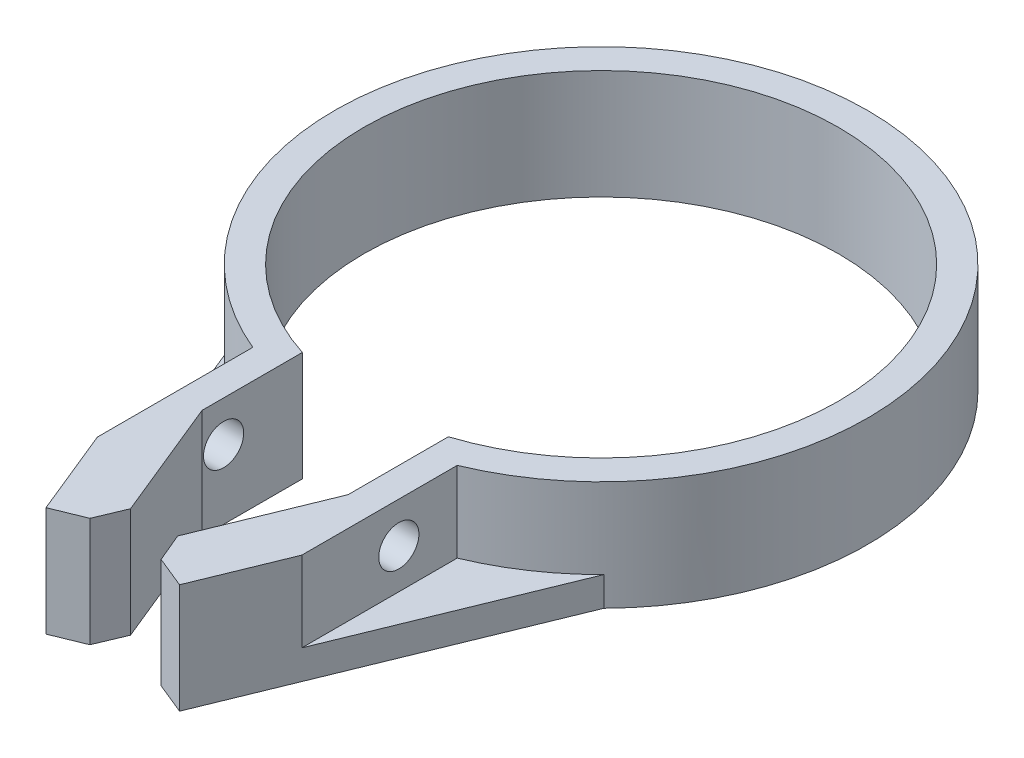
ISO-10303-21;
HEADER;
FILE_DESCRIPTION(('STEP AP214'),'2;1');
FILE_NAME('part.step','',(''),(''),'','','');
FILE_SCHEMA(('AUTOMOTIVE_DESIGN { 1 0 10303 214 1 1 1 1 }'));
ENDSEC;
DATA;
#1=APPLICATION_CONTEXT('core data for automotive mechanical design processes');
#2=APPLICATION_PROTOCOL_DEFINITION('international standard','automotive_design',2000,#1);
#3=PRODUCT_CONTEXT('',#1,'mechanical');
#4=PRODUCT('Part','Part','',(#3));
#5=PRODUCT_RELATED_PRODUCT_CATEGORY('part','',(#4));
#6=PRODUCT_DEFINITION_FORMATION('','',#4);
#7=PRODUCT_DEFINITION_CONTEXT('part definition',#1,'design');
#8=PRODUCT_DEFINITION('design','',#6,#7);
#9=PRODUCT_DEFINITION_SHAPE('','',#8);
#10=(LENGTH_UNIT() NAMED_UNIT(*) SI_UNIT(.MILLI.,.METRE.));
#11=(NAMED_UNIT(*) PLANE_ANGLE_UNIT() SI_UNIT($,.RADIAN.));
#12=(NAMED_UNIT(*) SI_UNIT($,.STERADIAN.) SOLID_ANGLE_UNIT());
#13=UNCERTAINTY_MEASURE_WITH_UNIT(LENGTH_MEASURE(1.E-05),#10,'distance_accuracy_value','');
#14=(GEOMETRIC_REPRESENTATION_CONTEXT(3) GLOBAL_UNCERTAINTY_ASSIGNED_CONTEXT((#13)) GLOBAL_UNIT_ASSIGNED_CONTEXT((#10,
#11,#12)) REPRESENTATION_CONTEXT('',''));
#15=CARTESIAN_POINT('',(0.,0.,0.));
#16=DIRECTION('',(0.,0.,1.));
#17=DIRECTION('',(1.,0.,0.));
#18=AXIS2_PLACEMENT_3D('',#15,#16,#17);
#19=CARTESIAN_POINT('',(-10.,15.,30.9232921921325));
#20=DIRECTION('',(-1.,0.,0.));
#21=DIRECTION('',(0.,0.,1.));
#22=AXIS2_PLACEMENT_3D('',#19,#20,#21);
#23=PLANE('',#22);
#24=CARTESIAN_POINT('',(-9.99999999999999,9.46650939826783,41.7083075813663));
#25=DIRECTION('',(-1.,0.,0.));
#26=DIRECTION('',(0.,0.,1.));
#27=AXIS2_PLACEMENT_3D('',#24,#25,#26);
#28=CIRCLE('',#27,2.75);
#29=CARTESIAN_POINT('',(-9.99999999999999,9.46650939826783,44.4583075813663));
#30=VERTEX_POINT('',#29);
#31=EDGE_CURVE('E183',#30,#30,#28,.T.);
#32=ORIENTED_EDGE('',*,*,#31,.T.);
#33=EDGE_LOOP('',(#32));
#34=FACE_BOUND('',#33,.T.);
#35=DIRECTION('',(0.,-1.,0.));
#36=VECTOR('',#35,1.);
#37=CARTESIAN_POINT('',(-10.,15.,44.654426434674));
#38=LINE('',#37,#36);
#39=CARTESIAN_POINT('',(-10.,15.,44.654426434674));
#40=VERTEX_POINT('',#39);
#41=CARTESIAN_POINT('',(-10.,0.,44.654426434674));
#42=VERTEX_POINT('',#41);
#43=EDGE_CURVE('E195',#40,#42,#38,.T.);
#44=ORIENTED_EDGE('',*,*,#43,.T.);
#45=DIRECTION('',(0.,0.,-1.));
#46=VECTOR('',#45,1.);
#47=CARTESIAN_POINT('',(-10.,0.,30.9232921921325));
#48=LINE('',#47,#46);
#49=CARTESIAN_POINT('',(-10.,0.,30.9232921921325));
#50=VERTEX_POINT('',#49);
#51=EDGE_CURVE('E245',#42,#50,#48,.T.);
#52=ORIENTED_EDGE('',*,*,#51,.T.);
#53=DIRECTION('',(0.,-1.,0.));
#54=VECTOR('',#53,1.);
#55=CARTESIAN_POINT('',(-10.,15.,30.9232921921325));
#56=LINE('',#55,#54);
#57=CARTESIAN_POINT('',(-10.,15.,30.9232921921325));
#58=VERTEX_POINT('',#57);
#59=EDGE_CURVE('E257',#58,#50,#56,.T.);
#60=ORIENTED_EDGE('',*,*,#59,.F.);
#61=DIRECTION('',(0.,0.,-1.));
#62=VECTOR('',#61,1.);
#63=CARTESIAN_POINT('',(-10.,15.,30.9232921921325));
#64=LINE('',#63,#62);
#65=EDGE_CURVE('E233',#40,#58,#64,.T.);
#66=ORIENTED_EDGE('',*,*,#65,.F.);
#67=EDGE_LOOP('',(#44,#52,#60,#66));
#68=FACE_BOUND('',#67,.T.);
#69=ADVANCED_FACE('F35',(#34,#68),#23,.F.);
#70=CARTESIAN_POINT('',(14.,15.,33.7083075813663));
#71=DIRECTION('',(-1.,0.,0.));
#72=DIRECTION('',(0.,0.,1.));
#73=AXIS2_PLACEMENT_3D('',#70,#71,#72);
#74=PLANE('',#73);
#75=CARTESIAN_POINT('',(14.,9.46650939826783,41.7083075813663));
#76=DIRECTION('',(1.,0.,0.));
#77=DIRECTION('',(0.,0.,-1.));
#78=AXIS2_PLACEMENT_3D('',#75,#76,#77);
#79=CIRCLE('',#78,2.75);
#80=CARTESIAN_POINT('',(14.,9.46650939826783,38.9583075813663));
#81=VERTEX_POINT('',#80);
#82=EDGE_CURVE('E527',#81,#81,#79,.T.);
#83=ORIENTED_EDGE('',*,*,#82,.F.);
#84=EDGE_LOOP('',(#83));
#85=FACE_BOUND('',#84,.T.);
#86=DIRECTION('',(0.,0.,-1.));
#87=VECTOR('',#86,1.);
#88=CARTESIAN_POINT('',(14.,4.,55.));
#89=LINE('',#88,#87);
#90=CARTESIAN_POINT('',(14.,4.,55.));
#91=VERTEX_POINT('',#90);
#92=CARTESIAN_POINT('',(14.,4.,33.7083075813663));
#93=VERTEX_POINT('',#92);
#94=EDGE_CURVE('E208',#91,#93,#89,.T.);
#95=ORIENTED_EDGE('',*,*,#94,.T.);
#96=DIRECTION('',(0.,-1.,0.));
#97=VECTOR('',#96,1.);
#98=CARTESIAN_POINT('',(14.,15.,33.7083075813663));
#99=LINE('',#98,#97);
#100=CARTESIAN_POINT('',(14.,15.,33.7083075813663));
#101=VERTEX_POINT('',#100);
#102=EDGE_CURVE('E242',#101,#93,#99,.T.);
#103=ORIENTED_EDGE('',*,*,#102,.F.);
#104=DIRECTION('',(0.,0.,-1.));
#105=VECTOR('',#104,1.);
#106=CARTESIAN_POINT('',(14.,15.,33.7083075813663));
#107=LINE('',#106,#105);
#108=CARTESIAN_POINT('',(14.,15.,55.));
#109=VERTEX_POINT('',#108);
#110=EDGE_CURVE('E240',#109,#101,#107,.T.);
#111=ORIENTED_EDGE('',*,*,#110,.F.);
#112=DIRECTION('',(0.,-1.,0.));
#113=VECTOR('',#112,1.);
#114=CARTESIAN_POINT('',(14.,15.,55.));
#115=LINE('',#114,#113);
#116=EDGE_CURVE('E176',#109,#91,#115,.T.);
#117=ORIENTED_EDGE('',*,*,#116,.T.);
#118=EDGE_LOOP('',(#95,#103,#111,#117));
#119=FACE_BOUND('',#118,.T.);
#120=ADVANCED_FACE('F315',(#85,#119),#74,.F.);
#121=CARTESIAN_POINT('',(0.,15.,0.));
#122=DIRECTION('',(0.,-1.,0.));
#123=DIRECTION('',(0.,0.,-1.));
#124=AXIS2_PLACEMENT_3D('',#121,#122,#123);
#125=CYLINDRICAL_SURFACE('',#124,36.5);
#126=CARTESIAN_POINT('',(0.,4.,0.));
#127=DIRECTION('',(0.,-1.,0.));
#128=DIRECTION('',(0.,0.,-1.));
#129=AXIS2_PLACEMENT_3D('',#126,#127,#128);
#130=CIRCLE('',#129,36.5);
#131=CARTESIAN_POINT('',(26.,4.,25.617376914899));
#132=VERTEX_POINT('',#131);
#133=EDGE_CURVE('E214',#132,#93,#130,.T.);
#134=ORIENTED_EDGE('',*,*,#133,.F.);
#135=DIRECTION('',(0.,-1.,0.));
#136=VECTOR('',#135,1.);
#137=CARTESIAN_POINT('',(26.,15.,25.617376914899));
#138=LINE('',#137,#136);
#139=CARTESIAN_POINT('',(26.,0.,25.617376914899));
#140=VERTEX_POINT('',#139);
#141=EDGE_CURVE('E211',#132,#140,#138,.T.);
#142=ORIENTED_EDGE('',*,*,#141,.T.);
#143=CARTESIAN_POINT('',(0.,0.,0.));
#144=DIRECTION('',(0.,1.,0.));
#145=DIRECTION('',(0.,0.,1.));
#146=AXIS2_PLACEMENT_3D('',#143,#144,#145);
#147=CIRCLE('',#146,36.5);
#148=CARTESIAN_POINT('',(-26.,0.,25.617376914899));
#149=VERTEX_POINT('',#148);
#150=EDGE_CURVE('E225',#140,#149,#147,.T.);
#151=ORIENTED_EDGE('',*,*,#150,.T.);
#152=DIRECTION('',(0.,-1.,0.));
#153=VECTOR('',#152,1.);
#154=CARTESIAN_POINT('',(-26.,15.,25.617376914899));
#155=LINE('',#154,#153);
#156=CARTESIAN_POINT('',(-26.,4.,25.617376914899));
#157=VERTEX_POINT('',#156);
#158=EDGE_CURVE('E220',#149,#157,#155,.F.);
#159=ORIENTED_EDGE('',*,*,#158,.T.);
#160=CARTESIAN_POINT('',(0.,4.,0.));
#161=DIRECTION('',(0.,1.,0.));
#162=DIRECTION('',(0.,0.,1.));
#163=AXIS2_PLACEMENT_3D('',#160,#161,#162);
#164=CIRCLE('',#163,36.5);
#165=CARTESIAN_POINT('',(-14.,4.,33.7083075813663));
#166=VERTEX_POINT('',#165);
#167=EDGE_CURVE('E223',#157,#166,#164,.T.);
#168=ORIENTED_EDGE('',*,*,#167,.T.);
#169=DIRECTION('',(0.,-1.,0.));
#170=VECTOR('',#169,1.);
#171=CARTESIAN_POINT('',(-14.,15.,33.7083075813663));
#172=LINE('',#171,#170);
#173=CARTESIAN_POINT('',(-14.,15.,33.7083075813663));
#174=VERTEX_POINT('',#173);
#175=EDGE_CURVE('E262',#174,#166,#172,.T.);
#176=ORIENTED_EDGE('',*,*,#175,.F.);
#177=CARTESIAN_POINT('',(0.,15.,0.));
#178=DIRECTION('',(0.,1.,0.));
#179=DIRECTION('',(0.,0.,1.));
#180=AXIS2_PLACEMENT_3D('',#177,#178,#179);
#181=CIRCLE('',#180,36.5);
#182=EDGE_CURVE('E226',#101,#174,#181,.T.);
#183=ORIENTED_EDGE('',*,*,#182,.F.);
#184=ORIENTED_EDGE('',*,*,#102,.T.);
#185=EDGE_LOOP('',(#134,#142,#151,#159,#168,#176,#183,#184));
#186=FACE_BOUND('',#185,.T.);
#187=ADVANCED_FACE('F309',(#186),#125,.T.);
#188=CARTESIAN_POINT('',(-14.,15.,33.7083075813663));
#189=DIRECTION('',(1.,0.,0.));
#190=DIRECTION('',(0.,0.,-1.));
#191=AXIS2_PLACEMENT_3D('',#188,#189,#190);
#192=PLANE('',#191);
#193=CARTESIAN_POINT('',(-14.,9.46650939826783,41.7083075813663));
#194=DIRECTION('',(1.,0.,0.));
#195=DIRECTION('',(0.,0.,-1.));
#196=AXIS2_PLACEMENT_3D('',#193,#194,#195);
#197=CIRCLE('',#196,2.75);
#198=CARTESIAN_POINT('',(-14.,9.46650939826783,38.9583075813663));
#199=VERTEX_POINT('',#198);
#200=EDGE_CURVE('E522',#199,#199,#197,.T.);
#201=ORIENTED_EDGE('',*,*,#200,.T.);
#202=EDGE_LOOP('',(#201));
#203=FACE_BOUND('',#202,.T.);
#204=ORIENTED_EDGE('',*,*,#175,.T.);
#205=DIRECTION('',(0.,0.,1.));
#206=VECTOR('',#205,1.);
#207=CARTESIAN_POINT('',(-14.,4.,55.));
#208=LINE('',#207,#206);
#209=CARTESIAN_POINT('',(-14.,4.,55.));
#210=VERTEX_POINT('',#209);
#211=EDGE_CURVE('E217',#166,#210,#208,.T.);
#212=ORIENTED_EDGE('',*,*,#211,.T.);
#213=DIRECTION('',(0.,-1.,0.));
#214=VECTOR('',#213,1.);
#215=CARTESIAN_POINT('',(-14.,15.,55.));
#216=LINE('',#215,#214);
#217=CARTESIAN_POINT('',(-14.,15.,55.));
#218=VERTEX_POINT('',#217);
#219=EDGE_CURVE('E260',#218,#210,#216,.T.);
#220=ORIENTED_EDGE('',*,*,#219,.F.);
#221=DIRECTION('',(0.,0.,1.));
#222=VECTOR('',#221,1.);
#223=CARTESIAN_POINT('',(-14.,15.,33.7083075813663));
#224=LINE('',#223,#222);
#225=EDGE_CURVE('E229',#174,#218,#224,.T.);
#226=ORIENTED_EDGE('',*,*,#225,.F.);
#227=EDGE_LOOP('',(#204,#212,#220,#226));
#228=FACE_BOUND('',#227,.T.);
#229=ADVANCED_FACE('F321',(#203,#228),#192,.F.);
#230=CARTESIAN_POINT('',(0.,15.,0.));
#231=DIRECTION('',(0.,-1.,0.));
#232=DIRECTION('',(0.,0.,-1.));
#233=AXIS2_PLACEMENT_3D('',#230,#231,#232);
#234=CYLINDRICAL_SURFACE('',#233,32.5);
#235=CARTESIAN_POINT('',(0.,0.,0.));
#236=DIRECTION('',(0.,-1.,0.));
#237=DIRECTION('',(0.,0.,1.));
#238=AXIS2_PLACEMENT_3D('',#235,#236,#237);
#239=CIRCLE('',#238,32.5);
#240=CARTESIAN_POINT('',(10.,0.,30.9232921921325));
#241=VERTEX_POINT('',#240);
#242=EDGE_CURVE('E247',#50,#241,#239,.T.);
#243=ORIENTED_EDGE('',*,*,#242,.T.);
#244=DIRECTION('',(0.,-1.,0.));
#245=VECTOR('',#244,1.);
#246=CARTESIAN_POINT('',(10.,15.,30.9232921921325));
#247=LINE('',#246,#245);
#248=CARTESIAN_POINT('',(10.,15.,30.9232921921325));
#249=VERTEX_POINT('',#248);
#250=EDGE_CURVE('E254',#249,#241,#247,.T.);
#251=ORIENTED_EDGE('',*,*,#250,.F.);
#252=CARTESIAN_POINT('',(0.,15.,0.));
#253=DIRECTION('',(0.,-1.,0.));
#254=DIRECTION('',(0.,0.,1.));
#255=AXIS2_PLACEMENT_3D('',#252,#253,#254);
#256=CIRCLE('',#255,32.5);
#257=EDGE_CURVE('E235',#58,#249,#256,.T.);
#258=ORIENTED_EDGE('',*,*,#257,.F.);
#259=ORIENTED_EDGE('',*,*,#59,.T.);
#260=EDGE_LOOP('',(#243,#251,#258,#259));
#261=FACE_BOUND('',#260,.T.);
#262=ADVANCED_FACE('F293',(#261),#234,.F.);
#263=CARTESIAN_POINT('',(10.,15.,30.9232921921325));
#264=DIRECTION('',(1.,0.,0.));
#265=DIRECTION('',(0.,0.,-1.));
#266=AXIS2_PLACEMENT_3D('',#263,#264,#265);
#267=PLANE('',#266);
#268=CARTESIAN_POINT('',(10.,9.46650939826783,41.7083075813663));
#269=DIRECTION('',(1.,0.,0.));
#270=DIRECTION('',(0.,0.,-1.));
#271=AXIS2_PLACEMENT_3D('',#268,#269,#270);
#272=CIRCLE('',#271,2.75);
#273=CARTESIAN_POINT('',(10.,9.46650939826783,38.9583075813663));
#274=VERTEX_POINT('',#273);
#275=EDGE_CURVE('E39',#274,#274,#272,.T.);
#276=ORIENTED_EDGE('',*,*,#275,.T.);
#277=EDGE_LOOP('',(#276));
#278=FACE_BOUND('',#277,.T.);
#279=DIRECTION('',(0.,0.,1.));
#280=VECTOR('',#279,1.);
#281=CARTESIAN_POINT('',(10.,0.,30.9232921921325));
#282=LINE('',#281,#280);
#283=CARTESIAN_POINT('',(10.,0.,44.6544264346739));
#284=VERTEX_POINT('',#283);
#285=EDGE_CURVE('E230',#241,#284,#282,.T.);
#286=ORIENTED_EDGE('',*,*,#285,.T.);
#287=DIRECTION('',(0.,-1.,0.));
#288=VECTOR('',#287,1.);
#289=CARTESIAN_POINT('',(10.,15.,44.6544264346739));
#290=LINE('',#289,#288);
#291=CARTESIAN_POINT('',(10.,15.,44.6544264346739));
#292=VERTEX_POINT('',#291);
#293=EDGE_CURVE('E161',#292,#284,#290,.T.);
#294=ORIENTED_EDGE('',*,*,#293,.F.);
#295=DIRECTION('',(0.,0.,1.));
#296=VECTOR('',#295,1.);
#297=CARTESIAN_POINT('',(10.,15.,30.9232921921325));
#298=LINE('',#297,#296);
#299=EDGE_CURVE('E237',#249,#292,#298,.T.);
#300=ORIENTED_EDGE('',*,*,#299,.F.);
#301=ORIENTED_EDGE('',*,*,#250,.T.);
#302=EDGE_LOOP('',(#286,#294,#300,#301));
#303=FACE_BOUND('',#302,.T.);
#304=ADVANCED_FACE('F298',(#278,#303),#267,.F.);
#305=CARTESIAN_POINT('',(0.,15.,0.));
#306=DIRECTION('',(0.,1.,0.));
#307=DIRECTION('',(0.,0.,1.));
#308=AXIS2_PLACEMENT_3D('',#305,#306,#307);
#309=PLANE('',#308);
#310=DIRECTION('',(0.378088546289443,0.,-0.925769437368039));
#311=VECTOR('',#310,1.);
#312=CARTESIAN_POINT('',(24.2005588123426,15.,9.88362083626792));
#313=LINE('',#312,#311);
#314=CARTESIAN_POINT('',(3.23096588935846,15.,61.2287579282716));
#315=VERTEX_POINT('',#314);
#316=EDGE_CURVE('E169',#315,#292,#313,.T.);
#317=ORIENTED_EDGE('',*,*,#316,.F.);
#318=DIRECTION('',(-0.387268872007964,0.,-0.921966821948425));
#319=VECTOR('',#318,1.);
#320=CARTESIAN_POINT('',(-19.1152751831885,15.,8.02930309647234));
#321=LINE('',#320,#319);
#322=CARTESIAN_POINT('',(4.87400856259425,15.,65.1403318792441));
#323=VERTEX_POINT('',#322);
#324=EDGE_CURVE('E168',#315,#323,#321,.F.);
#325=ORIENTED_EDGE('',*,*,#324,.T.);
#326=DIRECTION('',(-0.925769437368039,0.,-0.378088546289443));
#327=VECTOR('',#326,1.);
#328=CARTESIAN_POINT('',(-22.1038585618525,15.,54.1224454041079));
#329=LINE('',#328,#327);
#330=CARTESIAN_POINT('',(9.14608329700609,15.,66.8850670808789));
#331=VERTEX_POINT('',#330);
#332=EDGE_CURVE('E154',#331,#323,#329,.T.);
#333=ORIENTED_EDGE('',*,*,#332,.F.);
#334=DIRECTION('',(-0.378088546289443,0.,0.925769437368039));
#335=VECTOR('',#334,1.);
#336=CARTESIAN_POINT('',(31.2499418588586,15.,12.762621676771));
#337=LINE('',#336,#335);
#338=EDGE_CURVE('E166',#109,#331,#337,.T.);
#339=ORIENTED_EDGE('',*,*,#338,.F.);
#340=ORIENTED_EDGE('',*,*,#110,.T.);
#341=ORIENTED_EDGE('',*,*,#182,.T.);
#342=ORIENTED_EDGE('',*,*,#225,.T.);
#343=DIRECTION('',(0.378088546289443,0.,0.925769437368039));
#344=VECTOR('',#343,1.);
#345=CARTESIAN_POINT('',(-31.2499418588586,15.,12.762621676771));
#346=LINE('',#345,#344);
#347=CARTESIAN_POINT('',(-9.14608329700607,15.,66.8850670808789));
#348=VERTEX_POINT('',#347);
#349=EDGE_CURVE('E190',#218,#348,#346,.T.);
#350=ORIENTED_EDGE('',*,*,#349,.T.);
#351=DIRECTION('',(0.925769437368039,0.,-0.378088546289444));
#352=VECTOR('',#351,1.);
#353=CARTESIAN_POINT('',(22.1038585618525,15.,54.1224454041078));
#354=LINE('',#353,#352);
#355=CARTESIAN_POINT('',(-4.87400856259424,15.,65.1403318792441));
#356=VERTEX_POINT('',#355);
#357=EDGE_CURVE('E187',#348,#356,#354,.T.);
#358=ORIENTED_EDGE('',*,*,#357,.T.);
#359=DIRECTION('',(-0.387268872007964,0.,0.921966821948425));
#360=VECTOR('',#359,1.);
#361=CARTESIAN_POINT('',(19.1152751831886,15.,8.02930309647236));
#362=LINE('',#361,#360);
#363=CARTESIAN_POINT('',(-3.23096588935844,15.,61.2287579282717));
#364=VERTEX_POINT('',#363);
#365=EDGE_CURVE('E51',#356,#364,#362,.F.);
#366=ORIENTED_EDGE('',*,*,#365,.T.);
#367=DIRECTION('',(-0.378088546289444,0.,-0.925769437368039));
#368=VECTOR('',#367,1.);
#369=CARTESIAN_POINT('',(-24.2005588123426,15.,9.88362083626797));
#370=LINE('',#369,#368);
#371=EDGE_CURVE('E185',#364,#40,#370,.T.);
#372=ORIENTED_EDGE('',*,*,#371,.T.);
#373=ORIENTED_EDGE('',*,*,#65,.T.);
#374=ORIENTED_EDGE('',*,*,#257,.T.);
#375=ORIENTED_EDGE('',*,*,#299,.T.);
#376=EDGE_LOOP('',(#317,#325,#333,#339,#340,#341,#342,#350,#358,#366,#372,#373,#374,#375));
#377=FACE_BOUND('',#376,.T.);
#378=ADVANCED_FACE('F165',(#377),#309,.T.);
#379=CARTESIAN_POINT('',(0.,0.,0.));
#380=DIRECTION('',(0.,1.,0.));
#381=DIRECTION('',(0.,0.,1.));
#382=AXIS2_PLACEMENT_3D('',#379,#380,#381);
#383=PLANE('',#382);
#384=DIRECTION('',(-0.925769437368039,0.,-0.378088546289443));
#385=VECTOR('',#384,1.);
#386=CARTESIAN_POINT('',(-22.1038585618525,0.,54.1224454041079));
#387=LINE('',#386,#385);
#388=CARTESIAN_POINT('',(9.14608329700609,0.,66.8850670808789));
#389=VERTEX_POINT('',#388);
#390=CARTESIAN_POINT('',(4.87400856259425,0.,65.1403318792441));
#391=VERTEX_POINT('',#390);
#392=EDGE_CURVE('E157',#389,#391,#387,.T.);
#393=ORIENTED_EDGE('',*,*,#392,.T.);
#394=DIRECTION('',(0.387268872007964,0.,0.921966821948425));
#395=VECTOR('',#394,1.);
#396=CARTESIAN_POINT('',(4.87400856259425,0.,65.1403318792441));
#397=LINE('',#396,#395);
#398=CARTESIAN_POINT('',(3.23096588935846,0.,61.2287579282716));
#399=VERTEX_POINT('',#398);
#400=EDGE_CURVE('E269',#391,#399,#397,.F.);
#401=ORIENTED_EDGE('',*,*,#400,.T.);
#402=DIRECTION('',(0.378088546289443,0.,-0.925769437368039));
#403=VECTOR('',#402,1.);
#404=CARTESIAN_POINT('',(24.2005588123426,0.,9.88362083626792));
#405=LINE('',#404,#403);
#406=EDGE_CURVE('E170',#399,#284,#405,.T.);
#407=ORIENTED_EDGE('',*,*,#406,.T.);
#408=ORIENTED_EDGE('',*,*,#285,.F.);
#409=ORIENTED_EDGE('',*,*,#242,.F.);
#410=ORIENTED_EDGE('',*,*,#51,.F.);
#411=DIRECTION('',(-0.378088546289444,0.,-0.925769437368039));
#412=VECTOR('',#411,1.);
#413=CARTESIAN_POINT('',(-24.2005588123426,0.,9.88362083626797));
#414=LINE('',#413,#412);
#415=CARTESIAN_POINT('',(-3.23096588935844,0.,61.2287579282717));
#416=VERTEX_POINT('',#415);
#417=EDGE_CURVE('E160',#416,#42,#414,.T.);
#418=ORIENTED_EDGE('',*,*,#417,.F.);
#419=DIRECTION('',(0.387268872007964,0.,-0.921966821948425));
#420=VECTOR('',#419,1.);
#421=CARTESIAN_POINT('',(-3.23096588935845,0.,61.2287579282716));
#422=LINE('',#421,#420);
#423=CARTESIAN_POINT('',(-4.87400856259424,0.,65.1403318792441));
#424=VERTEX_POINT('',#423);
#425=EDGE_CURVE('E267',#416,#424,#422,.F.);
#426=ORIENTED_EDGE('',*,*,#425,.T.);
#427=DIRECTION('',(0.925769437368039,0.,-0.378088546289444));
#428=VECTOR('',#427,1.);
#429=CARTESIAN_POINT('',(22.1038585618525,0.,54.1224454041078));
#430=LINE('',#429,#428);
#431=CARTESIAN_POINT('',(-9.14608329700607,0.,66.8850670808789));
#432=VERTEX_POINT('',#431);
#433=EDGE_CURVE('E188',#432,#424,#430,.T.);
#434=ORIENTED_EDGE('',*,*,#433,.F.);
#435=DIRECTION('',(-0.378088546289443,0.,-0.925769437368039));
#436=VECTOR('',#435,1.);
#437=CARTESIAN_POINT('',(-26.,0.,25.617376914899));
#438=LINE('',#437,#436);
#439=EDGE_CURVE('E205',#432,#149,#438,.T.);
#440=ORIENTED_EDGE('',*,*,#439,.T.);
#441=ORIENTED_EDGE('',*,*,#150,.F.);
#442=DIRECTION('',(-0.378088546289443,0.,0.925769437368039));
#443=VECTOR('',#442,1.);
#444=CARTESIAN_POINT('',(14.,0.,55.));
#445=LINE('',#444,#443);
#446=EDGE_CURVE('E201',#140,#389,#445,.T.);
#447=ORIENTED_EDGE('',*,*,#446,.T.);
#448=EDGE_LOOP('',(#393,#401,#407,#408,#409,#410,#418,#426,#434,#440,#441,#447));
#449=FACE_BOUND('',#448,.T.);
#450=ADVANCED_FACE('F284',(#449),#383,.F.);
#451=CARTESIAN_POINT('',(0.,4.,0.));
#452=DIRECTION('',(0.,1.,0.));
#453=DIRECTION('',(0.,0.,1.));
#454=AXIS2_PLACEMENT_3D('',#451,#452,#453);
#455=PLANE('',#454);
#456=DIRECTION('',(-0.378088546289443,0.,-0.925769437368039));
#457=VECTOR('',#456,1.);
#458=CARTESIAN_POINT('',(-26.,4.,25.617376914899));
#459=LINE('',#458,#457);
#460=EDGE_CURVE('E203',#210,#157,#459,.T.);
#461=ORIENTED_EDGE('',*,*,#460,.F.);
#462=ORIENTED_EDGE('',*,*,#211,.F.);
#463=ORIENTED_EDGE('',*,*,#167,.F.);
#464=EDGE_LOOP('',(#461,#462,#463));
#465=FACE_BOUND('',#464,.T.);
#466=ADVANCED_FACE('F324',(#465),#455,.T.);
#467=CARTESIAN_POINT('',(0.,4.,0.));
#468=DIRECTION('',(0.,-1.,0.));
#469=DIRECTION('',(0.,0.,-1.));
#470=AXIS2_PLACEMENT_3D('',#467,#468,#469);
#471=PLANE('',#470);
#472=ORIENTED_EDGE('',*,*,#94,.F.);
#473=DIRECTION('',(-0.378088546289443,0.,0.925769437368039));
#474=VECTOR('',#473,1.);
#475=CARTESIAN_POINT('',(14.,4.,55.));
#476=LINE('',#475,#474);
#477=EDGE_CURVE('E198',#132,#91,#476,.T.);
#478=ORIENTED_EDGE('',*,*,#477,.F.);
#479=ORIENTED_EDGE('',*,*,#133,.T.);
#480=EDGE_LOOP('',(#472,#478,#479));
#481=FACE_BOUND('',#480,.T.);
#482=ADVANCED_FACE('F313',(#481),#471,.F.);
#483=CARTESIAN_POINT('',(-26.,0.,25.617376914899));
#484=DIRECTION('',(0.925769437368039,0.,-0.378088546289443));
#485=DIRECTION('',(-0.378088546289443,0.,-0.925769437368039));
#486=AXIS2_PLACEMENT_3D('',#483,#484,#485);
#487=PLANE('',#486);
#488=ORIENTED_EDGE('',*,*,#460,.T.);
#489=ORIENTED_EDGE('',*,*,#158,.F.);
#490=ORIENTED_EDGE('',*,*,#439,.F.);
#491=DIRECTION('',(0.,-1.,0.));
#492=VECTOR('',#491,1.);
#493=CARTESIAN_POINT('',(-9.14608329700607,15.,66.8850670808789));
#494=LINE('',#493,#492);
#495=EDGE_CURVE('E192',#348,#432,#494,.T.);
#496=ORIENTED_EDGE('',*,*,#495,.F.);
#497=ORIENTED_EDGE('',*,*,#349,.F.);
#498=ORIENTED_EDGE('',*,*,#219,.T.);
#499=EDGE_LOOP('',(#488,#489,#490,#496,#497,#498));
#500=FACE_BOUND('',#499,.T.);
#501=ADVANCED_FACE('F326',(#500),#487,.F.);
#502=CARTESIAN_POINT('',(14.,0.,55.));
#503=DIRECTION('',(-0.925769437368039,0.,-0.378088546289443));
#504=DIRECTION('',(-0.378088546289443,0.,0.925769437368039));
#505=AXIS2_PLACEMENT_3D('',#502,#503,#504);
#506=PLANE('',#505);
#507=ORIENTED_EDGE('',*,*,#477,.T.);
#508=ORIENTED_EDGE('',*,*,#116,.F.);
#509=ORIENTED_EDGE('',*,*,#338,.T.);
#510=DIRECTION('',(0.,-1.,0.));
#511=VECTOR('',#510,1.);
#512=CARTESIAN_POINT('',(9.14608329700609,15.,66.8850670808789));
#513=LINE('',#512,#511);
#514=EDGE_CURVE('E150',#331,#389,#513,.T.);
#515=ORIENTED_EDGE('',*,*,#514,.T.);
#516=ORIENTED_EDGE('',*,*,#446,.F.);
#517=ORIENTED_EDGE('',*,*,#141,.F.);
#518=EDGE_LOOP('',(#507,#508,#509,#515,#516,#517));
#519=FACE_BOUND('',#518,.T.);
#520=ADVANCED_FACE('F174',(#519),#506,.F.);
#521=CARTESIAN_POINT('',(-24.2005588123426,15.,9.88362083626797));
#522=DIRECTION('',(-0.925769437368039,0.,0.378088546289444));
#523=DIRECTION('',(0.378088546289444,0.,0.925769437368039));
#524=AXIS2_PLACEMENT_3D('',#521,#522,#523);
#525=PLANE('',#524);
#526=ORIENTED_EDGE('',*,*,#371,.F.);
#527=DIRECTION('',(0.,-1.,0.));
#528=VECTOR('',#527,1.);
#529=CARTESIAN_POINT('',(-3.23096588935845,15.,61.2287579282716));
#530=LINE('',#529,#528);
#531=EDGE_CURVE('E44',#364,#416,#530,.T.);
#532=ORIENTED_EDGE('',*,*,#531,.T.);
#533=ORIENTED_EDGE('',*,*,#417,.T.);
#534=ORIENTED_EDGE('',*,*,#43,.F.);
#535=EDGE_LOOP('',(#526,#532,#533,#534));
#536=FACE_BOUND('',#535,.T.);
#537=ADVANCED_FACE('F279',(#536),#525,.F.);
#538=CARTESIAN_POINT('',(22.1038585618525,15.,54.1224454041078));
#539=DIRECTION('',(-0.378088546289444,0.,-0.925769437368039));
#540=DIRECTION('',(-0.925769437368039,0.,0.378088546289444));
#541=AXIS2_PLACEMENT_3D('',#538,#539,#540);
#542=PLANE('',#541);
#543=ORIENTED_EDGE('',*,*,#433,.T.);
#544=DIRECTION('',(0.,1.,0.));
#545=VECTOR('',#544,1.);
#546=CARTESIAN_POINT('',(-4.87400856259424,15.,65.1403318792441));
#547=LINE('',#546,#545);
#548=EDGE_CURVE('E11',#424,#356,#547,.T.);
#549=ORIENTED_EDGE('',*,*,#548,.T.);
#550=ORIENTED_EDGE('',*,*,#357,.F.);
#551=ORIENTED_EDGE('',*,*,#495,.T.);
#552=EDGE_LOOP('',(#543,#549,#550,#551));
#553=FACE_BOUND('',#552,.T.);
#554=ADVANCED_FACE('F415',(#553),#542,.F.);
#555=CARTESIAN_POINT('',(-22.1038585618525,15.,54.1224454041079));
#556=DIRECTION('',(-0.378088546289443,0.,0.925769437368039));
#557=DIRECTION('',(0.925769437368039,0.,0.378088546289443));
#558=AXIS2_PLACEMENT_3D('',#555,#556,#557);
#559=PLANE('',#558);
#560=ORIENTED_EDGE('',*,*,#332,.T.);
#561=DIRECTION('',(0.,-1.,0.));
#562=VECTOR('',#561,1.);
#563=CARTESIAN_POINT('',(4.87400856259425,15.,65.1403318792441));
#564=LINE('',#563,#562);
#565=EDGE_CURVE('E265',#323,#391,#564,.T.);
#566=ORIENTED_EDGE('',*,*,#565,.T.);
#567=ORIENTED_EDGE('',*,*,#392,.F.);
#568=ORIENTED_EDGE('',*,*,#514,.F.);
#569=EDGE_LOOP('',(#560,#566,#567,#568));
#570=FACE_BOUND('',#569,.T.);
#571=ADVANCED_FACE('F152',(#570),#559,.T.);
#572=CARTESIAN_POINT('',(24.2005588123426,15.,9.88362083626792));
#573=DIRECTION('',(-0.925769437368039,0.,-0.378088546289443));
#574=DIRECTION('',(-0.378088546289443,0.,0.925769437368039));
#575=AXIS2_PLACEMENT_3D('',#572,#573,#574);
#576=PLANE('',#575);
#577=ORIENTED_EDGE('',*,*,#406,.F.);
#578=DIRECTION('',(0.,1.,0.));
#579=VECTOR('',#578,1.);
#580=CARTESIAN_POINT('',(3.23096588935846,15.,61.2287579282716));
#581=LINE('',#580,#579);
#582=EDGE_CURVE('E271',#399,#315,#581,.T.);
#583=ORIENTED_EDGE('',*,*,#582,.T.);
#584=ORIENTED_EDGE('',*,*,#316,.T.);
#585=ORIENTED_EDGE('',*,*,#293,.T.);
#586=EDGE_LOOP('',(#577,#583,#584,#585));
#587=FACE_BOUND('',#586,.T.);
#588=ADVANCED_FACE('F301',(#587),#576,.T.);
#589=CARTESIAN_POINT('',(4.87400856259425,15.,65.1403318792441));
#590=DIRECTION('',(0.921966821948425,0.,-0.387268872007964));
#591=DIRECTION('',(0.,-1.,0.));
#592=AXIS2_PLACEMENT_3D('',#589,#590,#591);
#593=PLANE('',#592);
#594=ORIENTED_EDGE('',*,*,#324,.F.);
#595=ORIENTED_EDGE('',*,*,#582,.F.);
#596=ORIENTED_EDGE('',*,*,#400,.F.);
#597=ORIENTED_EDGE('',*,*,#565,.F.);
#598=EDGE_LOOP('',(#594,#595,#596,#597));
#599=FACE_BOUND('',#598,.T.);
#600=ADVANCED_FACE('F304',(#599),#593,.F.);
#601=CARTESIAN_POINT('',(-3.23096588935845,15.,61.2287579282716));
#602=DIRECTION('',(-0.921966821948425,0.,-0.387268872007964));
#603=DIRECTION('',(0.,-1.,0.));
#604=AXIS2_PLACEMENT_3D('',#601,#602,#603);
#605=PLANE('',#604);
#606=ORIENTED_EDGE('',*,*,#365,.F.);
#607=ORIENTED_EDGE('',*,*,#548,.F.);
#608=ORIENTED_EDGE('',*,*,#425,.F.);
#609=ORIENTED_EDGE('',*,*,#531,.F.);
#610=EDGE_LOOP('',(#606,#607,#608,#609));
#611=FACE_BOUND('',#610,.T.);
#612=ADVANCED_FACE('F37',(#611),#605,.F.);
#613=CARTESIAN_POINT('',(-36.,9.46650939826783,41.7083075813663));
#614=DIRECTION('',(1.,0.,0.));
#615=DIRECTION('',(0.,0.,-1.));
#616=AXIS2_PLACEMENT_3D('',#613,#614,#615);
#617=CYLINDRICAL_SURFACE('',#616,2.75);
#618=ORIENTED_EDGE('',*,*,#82,.T.);
#619=EDGE_LOOP('',(#618));
#620=FACE_BOUND('',#619,.T.);
#621=ORIENTED_EDGE('',*,*,#275,.F.);
#622=EDGE_LOOP('',(#621));
#623=FACE_BOUND('',#622,.T.);
#624=ADVANCED_FACE('F329',(#620,#623),#617,.F.);
#625=ORIENTED_EDGE('',*,*,#200,.F.);
#626=EDGE_LOOP('',(#625));
#627=FACE_BOUND('',#626,.T.);
#628=ORIENTED_EDGE('',*,*,#31,.F.);
#629=EDGE_LOOP('',(#628));
#630=FACE_BOUND('',#629,.T.);
#631=ADVANCED_FACE('F334',(#627,#630),#617,.F.);
#632=CLOSED_SHELL('',(#69,#120,#187,#229,#262,#304,#378,#450,#466,#482,#501,#520,#537,#554,#571,
#588,#600,#612,#624,#631));
#633=MANIFOLD_SOLID_BREP('B2',#632);
#634=ADVANCED_BREP_SHAPE_REPRESENTATION('',(#18,#633),#14);
#635=SHAPE_DEFINITION_REPRESENTATION(#9,#634);
ENDSEC;
END-ISO-10303-21;
